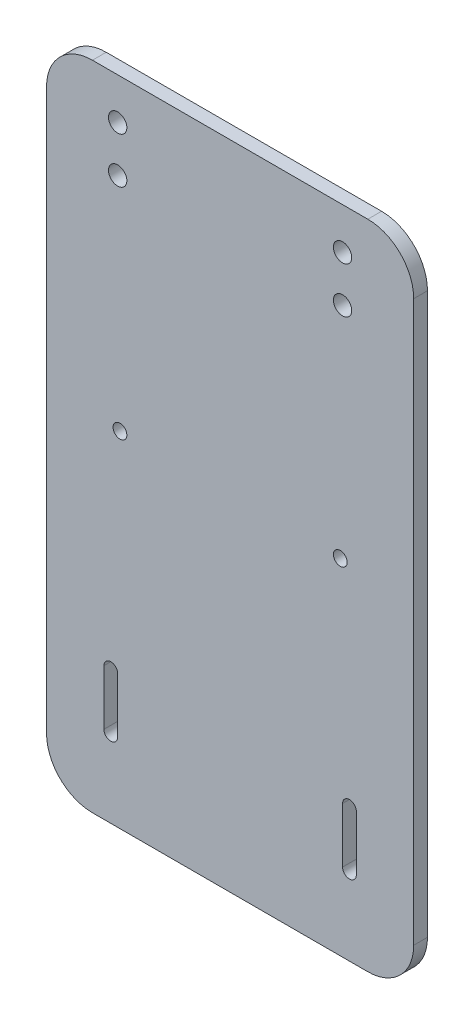
ISO-10303-21;
HEADER;
FILE_DESCRIPTION(('STEP AP214'),'2;1');
FILE_NAME('part.step','',(''),(''),'','','');
FILE_SCHEMA(('AUTOMOTIVE_DESIGN { 1 0 10303 214 1 1 1 1 }'));
ENDSEC;
DATA;
#1=APPLICATION_CONTEXT('core data for automotive mechanical design processes');
#2=APPLICATION_PROTOCOL_DEFINITION('international standard','automotive_design',2000,#1);
#3=PRODUCT_CONTEXT('',#1,'mechanical');
#4=PRODUCT('Part','Part','',(#3));
#5=PRODUCT_RELATED_PRODUCT_CATEGORY('part','',(#4));
#6=PRODUCT_DEFINITION_FORMATION('','',#4);
#7=PRODUCT_DEFINITION_CONTEXT('part definition',#1,'design');
#8=PRODUCT_DEFINITION('design','',#6,#7);
#9=PRODUCT_DEFINITION_SHAPE('','',#8);
#10=(LENGTH_UNIT() NAMED_UNIT(*) SI_UNIT(.MILLI.,.METRE.));
#11=(NAMED_UNIT(*) PLANE_ANGLE_UNIT() SI_UNIT($,.RADIAN.));
#12=(NAMED_UNIT(*) SI_UNIT($,.STERADIAN.) SOLID_ANGLE_UNIT());
#13=UNCERTAINTY_MEASURE_WITH_UNIT(LENGTH_MEASURE(1.E-05),#10,'distance_accuracy_value','');
#14=(GEOMETRIC_REPRESENTATION_CONTEXT(3) GLOBAL_UNCERTAINTY_ASSIGNED_CONTEXT((#13)) GLOBAL_UNIT_ASSIGNED_CONTEXT((#10,
#11,#12)) REPRESENTATION_CONTEXT('',''));
#15=CARTESIAN_POINT('',(0.,0.,0.));
#16=DIRECTION('',(0.,0.,1.));
#17=DIRECTION('',(1.,0.,0.));
#18=AXIS2_PLACEMENT_3D('',#15,#16,#17);
#19=CARTESIAN_POINT('',(0.,0.,3.));
#20=DIRECTION('',(0.,0.,1.));
#21=DIRECTION('',(1.,0.,0.));
#22=AXIS2_PLACEMENT_3D('',#19,#20,#21);
#23=PLANE('',#22);
#24=DIRECTION('',(1.,0.,0.));
#25=VECTOR('',#24,1.);
#26=CARTESIAN_POINT('',(-40.,67.,3.));
#27=LINE('',#26,#25);
#28=CARTESIAN_POINT('',(-30.,67.,3.));
#29=VERTEX_POINT('',#28);
#30=CARTESIAN_POINT('',(30.,67.,3.));
#31=VERTEX_POINT('',#30);
#32=EDGE_CURVE('E286',#29,#31,#27,.T.);
#33=ORIENTED_EDGE('',*,*,#32,.F.);
#34=CARTESIAN_POINT('',(-30.,57.,3.));
#35=DIRECTION('',(0.,0.,1.));
#36=DIRECTION('',(1.,0.,0.));
#37=AXIS2_PLACEMENT_3D('',#34,#35,#36);
#38=CIRCLE('',#37,10.);
#39=CARTESIAN_POINT('',(-40.,57.,3.));
#40=VERTEX_POINT('',#39);
#41=EDGE_CURVE('E258',#29,#40,#38,.T.);
#42=ORIENTED_EDGE('',*,*,#41,.T.);
#43=DIRECTION('',(0.,-1.,0.));
#44=VECTOR('',#43,1.);
#45=CARTESIAN_POINT('',(-40.,75.,3.));
#46=LINE('',#45,#44);
#47=CARTESIAN_POINT('',(-40.,-65.,3.));
#48=VERTEX_POINT('',#47);
#49=EDGE_CURVE('E199',#40,#48,#46,.T.);
#50=ORIENTED_EDGE('',*,*,#49,.T.);
#51=CARTESIAN_POINT('',(-30.,-65.,3.));
#52=DIRECTION('',(0.,0.,1.));
#53=DIRECTION('',(1.,0.,0.));
#54=AXIS2_PLACEMENT_3D('',#51,#52,#53);
#55=CIRCLE('',#54,10.);
#56=CARTESIAN_POINT('',(-30.,-75.,3.));
#57=VERTEX_POINT('',#56);
#58=EDGE_CURVE('E254',#48,#57,#55,.T.);
#59=ORIENTED_EDGE('',*,*,#58,.T.);
#60=DIRECTION('',(1.,0.,0.));
#61=VECTOR('',#60,1.);
#62=CARTESIAN_POINT('',(-40.,-75.,3.));
#63=LINE('',#62,#61);
#64=CARTESIAN_POINT('',(30.,-75.,3.));
#65=VERTEX_POINT('',#64);
#66=EDGE_CURVE('E203',#57,#65,#63,.T.);
#67=ORIENTED_EDGE('',*,*,#66,.T.);
#68=CARTESIAN_POINT('',(30.,-65.,3.));
#69=DIRECTION('',(0.,0.,1.));
#70=DIRECTION('',(1.,0.,0.));
#71=AXIS2_PLACEMENT_3D('',#68,#69,#70);
#72=CIRCLE('',#71,10.);
#73=CARTESIAN_POINT('',(40.,-65.,3.));
#74=VERTEX_POINT('',#73);
#75=EDGE_CURVE('E58',#65,#74,#72,.T.);
#76=ORIENTED_EDGE('',*,*,#75,.T.);
#77=DIRECTION('',(0.,1.,0.));
#78=VECTOR('',#77,1.);
#79=CARTESIAN_POINT('',(40.,75.,3.));
#80=LINE('',#79,#78);
#81=CARTESIAN_POINT('',(40.,57.,3.));
#82=VERTEX_POINT('',#81);
#83=EDGE_CURVE('E197',#74,#82,#80,.T.);
#84=ORIENTED_EDGE('',*,*,#83,.T.);
#85=CARTESIAN_POINT('',(30.,57.,3.));
#86=DIRECTION('',(0.,0.,1.));
#87=DIRECTION('',(1.,0.,0.));
#88=AXIS2_PLACEMENT_3D('',#85,#86,#87);
#89=CIRCLE('',#88,10.);
#90=EDGE_CURVE('E50',#82,#31,#89,.T.);
#91=ORIENTED_EDGE('',*,*,#90,.T.);
#92=EDGE_LOOP('',(#33,#42,#50,#59,#67,#76,#84,#91));
#93=FACE_BOUND('',#92,.T.);
#94=CARTESIAN_POINT('',(-24.5,58.,3.));
#95=DIRECTION('',(0.,0.,1.));
#96=DIRECTION('',(-1.,0.,0.));
#97=AXIS2_PLACEMENT_3D('',#94,#95,#96);
#98=CIRCLE('',#97,2.);
#99=CARTESIAN_POINT('',(-26.5,58.,3.));
#100=VERTEX_POINT('',#99);
#101=EDGE_CURVE('E297',#100,#100,#98,.T.);
#102=ORIENTED_EDGE('',*,*,#101,.F.);
#103=EDGE_LOOP('',(#102));
#104=FACE_BOUND('',#103,.T.);
#105=CARTESIAN_POINT('',(-24.5,48.,3.));
#106=DIRECTION('',(0.,0.,1.));
#107=DIRECTION('',(-1.,0.,0.));
#108=AXIS2_PLACEMENT_3D('',#105,#106,#107);
#109=CIRCLE('',#108,2.);
#110=CARTESIAN_POINT('',(-26.5,48.,3.));
#111=VERTEX_POINT('',#110);
#112=EDGE_CURVE('E300',#111,#111,#109,.T.);
#113=ORIENTED_EDGE('',*,*,#112,.F.);
#114=EDGE_LOOP('',(#113));
#115=FACE_BOUND('',#114,.T.);
#116=CARTESIAN_POINT('',(24.5,48.,3.));
#117=DIRECTION('',(0.,0.,1.));
#118=DIRECTION('',(1.,0.,0.));
#119=AXIS2_PLACEMENT_3D('',#116,#117,#118);
#120=CIRCLE('',#119,2.);
#121=CARTESIAN_POINT('',(26.5,48.,3.));
#122=VERTEX_POINT('',#121);
#123=EDGE_CURVE('E303',#122,#122,#120,.T.);
#124=ORIENTED_EDGE('',*,*,#123,.F.);
#125=EDGE_LOOP('',(#124));
#126=FACE_BOUND('',#125,.T.);
#127=CARTESIAN_POINT('',(24.5,58.,3.));
#128=DIRECTION('',(0.,0.,1.));
#129=DIRECTION('',(1.,0.,0.));
#130=AXIS2_PLACEMENT_3D('',#127,#128,#129);
#131=CIRCLE('',#130,2.);
#132=CARTESIAN_POINT('',(26.5,58.,3.));
#133=VERTEX_POINT('',#132);
#134=EDGE_CURVE('E228',#133,#133,#131,.T.);
#135=ORIENTED_EDGE('',*,*,#134,.F.);
#136=EDGE_LOOP('',(#135));
#137=FACE_BOUND('',#136,.T.);
#138=DIRECTION('',(0.,-1.,0.));
#139=VECTOR('',#138,1.);
#140=CARTESIAN_POINT('',(-27.5,-58.,3.));
#141=LINE('',#140,#139);
#142=CARTESIAN_POINT('',(-27.5,-46.,3.));
#143=VERTEX_POINT('',#142);
#144=CARTESIAN_POINT('',(-27.5,-58.,3.));
#145=VERTEX_POINT('',#144);
#146=EDGE_CURVE('E311',#143,#145,#141,.T.);
#147=ORIENTED_EDGE('',*,*,#146,.F.);
#148=CARTESIAN_POINT('',(-26.,-46.,3.));
#149=DIRECTION('',(0.,0.,1.));
#150=DIRECTION('',(1.,0.,0.));
#151=AXIS2_PLACEMENT_3D('',#148,#149,#150);
#152=CIRCLE('',#151,1.5);
#153=CARTESIAN_POINT('',(-24.5,-46.,3.));
#154=VERTEX_POINT('',#153);
#155=EDGE_CURVE('E171',#154,#143,#152,.T.);
#156=ORIENTED_EDGE('',*,*,#155,.F.);
#157=DIRECTION('',(0.,1.,0.));
#158=VECTOR('',#157,1.);
#159=CARTESIAN_POINT('',(-24.5,-58.,3.));
#160=LINE('',#159,#158);
#161=CARTESIAN_POINT('',(-24.5,-58.,3.));
#162=VERTEX_POINT('',#161);
#163=EDGE_CURVE('E154',#162,#154,#160,.T.);
#164=ORIENTED_EDGE('',*,*,#163,.F.);
#165=CARTESIAN_POINT('',(-26.,-58.,3.));
#166=DIRECTION('',(0.,0.,1.));
#167=DIRECTION('',(1.,0.,0.));
#168=AXIS2_PLACEMENT_3D('',#165,#166,#167);
#169=CIRCLE('',#168,1.5);
#170=EDGE_CURVE('E169',#145,#162,#169,.T.);
#171=ORIENTED_EDGE('',*,*,#170,.F.);
#172=EDGE_LOOP('',(#147,#156,#164,#171));
#173=FACE_BOUND('',#172,.T.);
#174=DIRECTION('',(0.,-1.,0.));
#175=VECTOR('',#174,1.);
#176=CARTESIAN_POINT('',(24.5,-58.,3.));
#177=LINE('',#176,#175);
#178=CARTESIAN_POINT('',(24.5,-46.,3.));
#179=VERTEX_POINT('',#178);
#180=CARTESIAN_POINT('',(24.5,-58.,3.));
#181=VERTEX_POINT('',#180);
#182=EDGE_CURVE('E323',#179,#181,#177,.T.);
#183=ORIENTED_EDGE('',*,*,#182,.F.);
#184=CARTESIAN_POINT('',(26.,-46.,3.));
#185=DIRECTION('',(0.,0.,1.));
#186=DIRECTION('',(-1.,0.,0.));
#187=AXIS2_PLACEMENT_3D('',#184,#185,#186);
#188=CIRCLE('',#187,1.5);
#189=CARTESIAN_POINT('',(27.5,-46.,3.));
#190=VERTEX_POINT('',#189);
#191=EDGE_CURVE('E320',#190,#179,#188,.T.);
#192=ORIENTED_EDGE('',*,*,#191,.F.);
#193=DIRECTION('',(0.,1.,0.));
#194=VECTOR('',#193,1.);
#195=CARTESIAN_POINT('',(27.5,-58.,3.));
#196=LINE('',#195,#194);
#197=CARTESIAN_POINT('',(27.5,-58.,3.));
#198=VERTEX_POINT('',#197);
#199=EDGE_CURVE('E237',#198,#190,#196,.T.);
#200=ORIENTED_EDGE('',*,*,#199,.F.);
#201=CARTESIAN_POINT('',(26.,-58.,3.));
#202=DIRECTION('',(0.,0.,1.));
#203=DIRECTION('',(1.,0.,0.));
#204=AXIS2_PLACEMENT_3D('',#201,#202,#203);
#205=CIRCLE('',#204,1.5);
#206=EDGE_CURVE('E182',#181,#198,#205,.T.);
#207=ORIENTED_EDGE('',*,*,#206,.F.);
#208=EDGE_LOOP('',(#183,#192,#200,#207));
#209=FACE_BOUND('',#208,.T.);
#210=CARTESIAN_POINT('',(24.,0.,3.));
#211=DIRECTION('',(0.,0.,1.));
#212=DIRECTION('',(1.,0.,0.));
#213=AXIS2_PLACEMENT_3D('',#210,#211,#212);
#214=CIRCLE('',#213,1.5);
#215=CARTESIAN_POINT('',(25.5,0.,3.));
#216=VERTEX_POINT('',#215);
#217=EDGE_CURVE('E191',#216,#216,#214,.T.);
#218=ORIENTED_EDGE('',*,*,#217,.F.);
#219=EDGE_LOOP('',(#218));
#220=FACE_BOUND('',#219,.T.);
#221=CARTESIAN_POINT('',(-24.,0.,3.));
#222=DIRECTION('',(0.,0.,1.));
#223=DIRECTION('',(-1.,0.,0.));
#224=AXIS2_PLACEMENT_3D('',#221,#222,#223);
#225=CIRCLE('',#224,1.5);
#226=CARTESIAN_POINT('',(-25.5,0.,3.));
#227=VERTEX_POINT('',#226);
#228=EDGE_CURVE('E180',#227,#227,#225,.T.);
#229=ORIENTED_EDGE('',*,*,#228,.F.);
#230=EDGE_LOOP('',(#229));
#231=FACE_BOUND('',#230,.T.);
#232=ADVANCED_FACE('F35',(#93,#104,#115,#126,#137,#173,#209,#220,#231),#23,.T.);
#233=CARTESIAN_POINT('',(0.,0.,0.));
#234=DIRECTION('',(0.,0.,1.));
#235=DIRECTION('',(1.,0.,0.));
#236=AXIS2_PLACEMENT_3D('',#233,#234,#235);
#237=PLANE('',#236);
#238=CARTESIAN_POINT('',(-24.5,58.,0.));
#239=DIRECTION('',(0.,0.,1.));
#240=DIRECTION('',(1.,0.,0.));
#241=AXIS2_PLACEMENT_3D('',#238,#239,#240);
#242=CIRCLE('',#241,2.);
#243=CARTESIAN_POINT('',(-22.5,58.,0.));
#244=VERTEX_POINT('',#243);
#245=EDGE_CURVE('E234',#244,#244,#242,.T.);
#246=ORIENTED_EDGE('',*,*,#245,.T.);
#247=EDGE_LOOP('',(#246));
#248=FACE_BOUND('',#247,.T.);
#249=CARTESIAN_POINT('',(-24.5,48.,0.));
#250=DIRECTION('',(0.,0.,1.));
#251=DIRECTION('',(1.,0.,0.));
#252=AXIS2_PLACEMENT_3D('',#249,#250,#251);
#253=CIRCLE('',#252,2.);
#254=CARTESIAN_POINT('',(-22.5,48.,0.));
#255=VERTEX_POINT('',#254);
#256=EDGE_CURVE('E231',#255,#255,#253,.T.);
#257=ORIENTED_EDGE('',*,*,#256,.T.);
#258=EDGE_LOOP('',(#257));
#259=FACE_BOUND('',#258,.T.);
#260=CARTESIAN_POINT('',(24.5,48.,0.));
#261=DIRECTION('',(0.,0.,1.));
#262=DIRECTION('',(1.,0.,0.));
#263=AXIS2_PLACEMENT_3D('',#260,#261,#262);
#264=CIRCLE('',#263,2.);
#265=CARTESIAN_POINT('',(26.5,48.,0.));
#266=VERTEX_POINT('',#265);
#267=EDGE_CURVE('E227',#266,#266,#264,.T.);
#268=ORIENTED_EDGE('',*,*,#267,.T.);
#269=EDGE_LOOP('',(#268));
#270=FACE_BOUND('',#269,.T.);
#271=CARTESIAN_POINT('',(24.5,58.,0.));
#272=DIRECTION('',(0.,0.,1.));
#273=DIRECTION('',(1.,0.,0.));
#274=AXIS2_PLACEMENT_3D('',#271,#272,#273);
#275=CIRCLE('',#274,2.);
#276=CARTESIAN_POINT('',(26.5,58.,0.));
#277=VERTEX_POINT('',#276);
#278=EDGE_CURVE('E224',#277,#277,#275,.T.);
#279=ORIENTED_EDGE('',*,*,#278,.T.);
#280=EDGE_LOOP('',(#279));
#281=FACE_BOUND('',#280,.T.);
#282=DIRECTION('',(0.,-1.,0.));
#283=VECTOR('',#282,1.);
#284=CARTESIAN_POINT('',(-40.,75.,0.));
#285=LINE('',#284,#283);
#286=CARTESIAN_POINT('',(-40.,57.,0.));
#287=VERTEX_POINT('',#286);
#288=CARTESIAN_POINT('',(-40.,-65.,0.));
#289=VERTEX_POINT('',#288);
#290=EDGE_CURVE('E208',#287,#289,#285,.T.);
#291=ORIENTED_EDGE('',*,*,#290,.F.);
#292=CARTESIAN_POINT('',(-30.,57.,0.));
#293=DIRECTION('',(0.,0.,1.));
#294=DIRECTION('',(1.,0.,0.));
#295=AXIS2_PLACEMENT_3D('',#292,#293,#294);
#296=CIRCLE('',#295,10.);
#297=CARTESIAN_POINT('',(-30.,67.,0.));
#298=VERTEX_POINT('',#297);
#299=EDGE_CURVE('E248',#287,#298,#296,.F.);
#300=ORIENTED_EDGE('',*,*,#299,.T.);
#301=DIRECTION('',(1.,0.,0.));
#302=VECTOR('',#301,1.);
#303=CARTESIAN_POINT('',(0.,67.,0.));
#304=LINE('',#303,#302);
#305=CARTESIAN_POINT('',(30.,67.,0.));
#306=VERTEX_POINT('',#305);
#307=EDGE_CURVE('E293',#298,#306,#304,.T.);
#308=ORIENTED_EDGE('',*,*,#307,.T.);
#309=CARTESIAN_POINT('',(30.,57.,0.));
#310=DIRECTION('',(0.,0.,1.));
#311=DIRECTION('',(1.,0.,0.));
#312=AXIS2_PLACEMENT_3D('',#309,#310,#311);
#313=CIRCLE('',#312,10.);
#314=CARTESIAN_POINT('',(40.,57.,0.));
#315=VERTEX_POINT('',#314);
#316=EDGE_CURVE('E246',#306,#315,#313,.F.);
#317=ORIENTED_EDGE('',*,*,#316,.T.);
#318=DIRECTION('',(0.,1.,0.));
#319=VECTOR('',#318,1.);
#320=CARTESIAN_POINT('',(40.,75.,0.));
#321=LINE('',#320,#319);
#322=CARTESIAN_POINT('',(40.,-65.,0.));
#323=VERTEX_POINT('',#322);
#324=EDGE_CURVE('E194',#323,#315,#321,.T.);
#325=ORIENTED_EDGE('',*,*,#324,.F.);
#326=CARTESIAN_POINT('',(30.,-65.,0.));
#327=DIRECTION('',(0.,0.,1.));
#328=DIRECTION('',(1.,0.,0.));
#329=AXIS2_PLACEMENT_3D('',#326,#327,#328);
#330=CIRCLE('',#329,10.);
#331=CARTESIAN_POINT('',(30.,-75.,0.));
#332=VERTEX_POINT('',#331);
#333=EDGE_CURVE('E244',#323,#332,#330,.F.);
#334=ORIENTED_EDGE('',*,*,#333,.T.);
#335=DIRECTION('',(1.,0.,0.));
#336=VECTOR('',#335,1.);
#337=CARTESIAN_POINT('',(-40.,-75.,0.));
#338=LINE('',#337,#336);
#339=CARTESIAN_POINT('',(-30.,-75.,0.));
#340=VERTEX_POINT('',#339);
#341=EDGE_CURVE('E200',#340,#332,#338,.T.);
#342=ORIENTED_EDGE('',*,*,#341,.F.);
#343=CARTESIAN_POINT('',(-30.,-65.,0.));
#344=DIRECTION('',(0.,0.,1.));
#345=DIRECTION('',(1.,0.,0.));
#346=AXIS2_PLACEMENT_3D('',#343,#344,#345);
#347=CIRCLE('',#346,10.);
#348=EDGE_CURVE('E242',#340,#289,#347,.F.);
#349=ORIENTED_EDGE('',*,*,#348,.T.);
#350=EDGE_LOOP('',(#291,#300,#308,#317,#325,#334,#342,#349));
#351=FACE_BOUND('',#350,.T.);
#352=CARTESIAN_POINT('',(24.,0.,0.));
#353=DIRECTION('',(0.,0.,1.));
#354=DIRECTION('',(1.,0.,0.));
#355=AXIS2_PLACEMENT_3D('',#352,#353,#354);
#356=CIRCLE('',#355,1.5);
#357=CARTESIAN_POINT('',(25.5,0.,0.));
#358=VERTEX_POINT('',#357);
#359=EDGE_CURVE('E189',#358,#358,#356,.T.);
#360=ORIENTED_EDGE('',*,*,#359,.T.);
#361=EDGE_LOOP('',(#360));
#362=FACE_BOUND('',#361,.T.);
#363=CARTESIAN_POINT('',(-24.,0.,0.));
#364=DIRECTION('',(0.,0.,1.));
#365=DIRECTION('',(-1.,0.,0.));
#366=AXIS2_PLACEMENT_3D('',#363,#364,#365);
#367=CIRCLE('',#366,1.5);
#368=CARTESIAN_POINT('',(-25.5,0.,0.));
#369=VERTEX_POINT('',#368);
#370=EDGE_CURVE('E176',#369,#369,#367,.T.);
#371=ORIENTED_EDGE('',*,*,#370,.T.);
#372=EDGE_LOOP('',(#371));
#373=FACE_BOUND('',#372,.T.);
#374=CARTESIAN_POINT('',(-26.,-46.,0.));
#375=DIRECTION('',(0.,0.,1.));
#376=DIRECTION('',(1.,0.,0.));
#377=AXIS2_PLACEMENT_3D('',#374,#375,#376);
#378=CIRCLE('',#377,1.5);
#379=CARTESIAN_POINT('',(-24.5,-46.,0.));
#380=VERTEX_POINT('',#379);
#381=CARTESIAN_POINT('',(-27.5,-46.,0.));
#382=VERTEX_POINT('',#381);
#383=EDGE_CURVE('E220',#380,#382,#378,.T.);
#384=ORIENTED_EDGE('',*,*,#383,.T.);
#385=DIRECTION('',(0.,-1.,0.));
#386=VECTOR('',#385,1.);
#387=CARTESIAN_POINT('',(-27.5,0.,0.));
#388=LINE('',#387,#386);
#389=CARTESIAN_POINT('',(-27.5,-58.,0.));
#390=VERTEX_POINT('',#389);
#391=EDGE_CURVE('E334',#382,#390,#388,.T.);
#392=ORIENTED_EDGE('',*,*,#391,.T.);
#393=CARTESIAN_POINT('',(-26.,-58.,0.));
#394=DIRECTION('',(0.,0.,1.));
#395=DIRECTION('',(1.,0.,0.));
#396=AXIS2_PLACEMENT_3D('',#393,#394,#395);
#397=CIRCLE('',#396,1.5);
#398=CARTESIAN_POINT('',(-24.5,-58.,0.));
#399=VERTEX_POINT('',#398);
#400=EDGE_CURVE('E177',#390,#399,#397,.T.);
#401=ORIENTED_EDGE('',*,*,#400,.T.);
#402=DIRECTION('',(0.,1.,0.));
#403=VECTOR('',#402,1.);
#404=CARTESIAN_POINT('',(-24.5,0.,0.));
#405=LINE('',#404,#403);
#406=EDGE_CURVE('E157',#399,#380,#405,.T.);
#407=ORIENTED_EDGE('',*,*,#406,.T.);
#408=EDGE_LOOP('',(#384,#392,#401,#407));
#409=FACE_BOUND('',#408,.T.);
#410=CARTESIAN_POINT('',(26.,-46.,0.));
#411=DIRECTION('',(0.,0.,1.));
#412=DIRECTION('',(1.,0.,0.));
#413=AXIS2_PLACEMENT_3D('',#410,#411,#412);
#414=CIRCLE('',#413,1.5);
#415=CARTESIAN_POINT('',(27.5,-46.,0.));
#416=VERTEX_POINT('',#415);
#417=CARTESIAN_POINT('',(24.5,-46.,0.));
#418=VERTEX_POINT('',#417);
#419=EDGE_CURVE('E217',#416,#418,#414,.T.);
#420=ORIENTED_EDGE('',*,*,#419,.T.);
#421=DIRECTION('',(0.,-1.,0.));
#422=VECTOR('',#421,1.);
#423=CARTESIAN_POINT('',(24.5000000000001,0.,0.));
#424=LINE('',#423,#422);
#425=CARTESIAN_POINT('',(24.5,-58.,0.));
#426=VERTEX_POINT('',#425);
#427=EDGE_CURVE('E330',#418,#426,#424,.T.);
#428=ORIENTED_EDGE('',*,*,#427,.T.);
#429=CARTESIAN_POINT('',(26.,-58.,0.));
#430=DIRECTION('',(0.,0.,1.));
#431=DIRECTION('',(1.,0.,0.));
#432=AXIS2_PLACEMENT_3D('',#429,#430,#431);
#433=CIRCLE('',#432,1.5);
#434=CARTESIAN_POINT('',(27.5,-58.,0.));
#435=VERTEX_POINT('',#434);
#436=EDGE_CURVE('E185',#426,#435,#433,.T.);
#437=ORIENTED_EDGE('',*,*,#436,.T.);
#438=DIRECTION('',(0.,1.,0.));
#439=VECTOR('',#438,1.);
#440=CARTESIAN_POINT('',(27.5,0.,0.));
#441=LINE('',#440,#439);
#442=EDGE_CURVE('E316',#435,#416,#441,.T.);
#443=ORIENTED_EDGE('',*,*,#442,.T.);
#444=EDGE_LOOP('',(#420,#428,#437,#443));
#445=FACE_BOUND('',#444,.T.);
#446=ADVANCED_FACE('F275',(#248,#259,#270,#281,#351,#362,#373,#409,#445),#237,.F.);
#447=CARTESIAN_POINT('',(40.,75.,3.));
#448=DIRECTION('',(-1.,0.,0.));
#449=DIRECTION('',(0.,-1.,0.));
#450=AXIS2_PLACEMENT_3D('',#447,#448,#449);
#451=PLANE('',#450);
#452=ORIENTED_EDGE('',*,*,#324,.T.);
#453=DIRECTION('',(0.,0.,1.));
#454=VECTOR('',#453,1.);
#455=CARTESIAN_POINT('',(40.,57.,3.));
#456=LINE('',#455,#454);
#457=EDGE_CURVE('E263',#315,#82,#456,.T.);
#458=ORIENTED_EDGE('',*,*,#457,.T.);
#459=ORIENTED_EDGE('',*,*,#83,.F.);
#460=DIRECTION('',(0.,0.,-1.));
#461=VECTOR('',#460,1.);
#462=CARTESIAN_POINT('',(40.,-65.,3.));
#463=LINE('',#462,#461);
#464=EDGE_CURVE('E260',#74,#323,#463,.T.);
#465=ORIENTED_EDGE('',*,*,#464,.T.);
#466=EDGE_LOOP('',(#452,#458,#459,#465));
#467=FACE_BOUND('',#466,.T.);
#468=ADVANCED_FACE('F282',(#467),#451,.F.);
#469=CARTESIAN_POINT('',(-40.,75.,3.));
#470=DIRECTION('',(1.,0.,0.));
#471=DIRECTION('',(0.,1.,0.));
#472=AXIS2_PLACEMENT_3D('',#469,#470,#471);
#473=PLANE('',#472);
#474=ORIENTED_EDGE('',*,*,#49,.F.);
#475=DIRECTION('',(0.,0.,-1.));
#476=VECTOR('',#475,1.);
#477=CARTESIAN_POINT('',(-40.,57.,3.));
#478=LINE('',#477,#476);
#479=EDGE_CURVE('E239',#40,#287,#478,.T.);
#480=ORIENTED_EDGE('',*,*,#479,.T.);
#481=ORIENTED_EDGE('',*,*,#290,.T.);
#482=DIRECTION('',(0.,0.,-1.));
#483=VECTOR('',#482,1.);
#484=CARTESIAN_POINT('',(-40.,-65.,3.));
#485=LINE('',#484,#483);
#486=EDGE_CURVE('E223',#289,#48,#485,.F.);
#487=ORIENTED_EDGE('',*,*,#486,.T.);
#488=EDGE_LOOP('',(#474,#480,#481,#487));
#489=FACE_BOUND('',#488,.T.);
#490=ADVANCED_FACE('F379',(#489),#473,.F.);
#491=CARTESIAN_POINT('',(-40.,-75.,3.));
#492=DIRECTION('',(0.,1.,0.));
#493=DIRECTION('',(-1.,0.,0.));
#494=AXIS2_PLACEMENT_3D('',#491,#492,#493);
#495=PLANE('',#494);
#496=ORIENTED_EDGE('',*,*,#341,.T.);
#497=DIRECTION('',(0.,0.,-1.));
#498=VECTOR('',#497,1.);
#499=CARTESIAN_POINT('',(30.,-75.,3.));
#500=LINE('',#499,#498);
#501=EDGE_CURVE('E11',#332,#65,#500,.F.);
#502=ORIENTED_EDGE('',*,*,#501,.T.);
#503=ORIENTED_EDGE('',*,*,#66,.F.);
#504=DIRECTION('',(0.,0.,-1.));
#505=VECTOR('',#504,1.);
#506=CARTESIAN_POINT('',(-30.,-75.,3.));
#507=LINE('',#506,#505);
#508=EDGE_CURVE('E43',#57,#340,#507,.T.);
#509=ORIENTED_EDGE('',*,*,#508,.T.);
#510=EDGE_LOOP('',(#496,#502,#503,#509));
#511=FACE_BOUND('',#510,.T.);
#512=ADVANCED_FACE('F269',(#511),#495,.F.);
#513=CARTESIAN_POINT('',(24.,0.,3.));
#514=DIRECTION('',(0.,0.,-1.));
#515=DIRECTION('',(-1.,0.,0.));
#516=AXIS2_PLACEMENT_3D('',#513,#514,#515);
#517=CYLINDRICAL_SURFACE('',#516,1.5);
#518=ORIENTED_EDGE('',*,*,#217,.T.);
#519=EDGE_LOOP('',(#518));
#520=FACE_BOUND('',#519,.T.);
#521=ORIENTED_EDGE('',*,*,#359,.F.);
#522=EDGE_LOOP('',(#521));
#523=FACE_BOUND('',#522,.T.);
#524=ADVANCED_FACE('F374',(#520,#523),#517,.F.);
#525=CARTESIAN_POINT('',(-24.,0.,3.));
#526=DIRECTION('',(0.,0.,-1.));
#527=DIRECTION('',(-1.,0.,0.));
#528=AXIS2_PLACEMENT_3D('',#525,#526,#527);
#529=CYLINDRICAL_SURFACE('',#528,1.5);
#530=ORIENTED_EDGE('',*,*,#228,.T.);
#531=EDGE_LOOP('',(#530));
#532=FACE_BOUND('',#531,.T.);
#533=ORIENTED_EDGE('',*,*,#370,.F.);
#534=EDGE_LOOP('',(#533));
#535=FACE_BOUND('',#534,.T.);
#536=ADVANCED_FACE('F552',(#532,#535),#529,.F.);
#537=CARTESIAN_POINT('',(-26.,-58.,3.));
#538=DIRECTION('',(0.,0.,-1.));
#539=DIRECTION('',(-1.,0.,0.));
#540=AXIS2_PLACEMENT_3D('',#537,#538,#539);
#541=CYLINDRICAL_SURFACE('',#540,1.5);
#542=DIRECTION('',(0.,0.,-1.));
#543=VECTOR('',#542,1.);
#544=CARTESIAN_POINT('',(-27.5,-58.,3.));
#545=LINE('',#544,#543);
#546=EDGE_CURVE('E162',#145,#390,#545,.T.);
#547=ORIENTED_EDGE('',*,*,#546,.F.);
#548=ORIENTED_EDGE('',*,*,#170,.T.);
#549=DIRECTION('',(0.,0.,-1.));
#550=VECTOR('',#549,1.);
#551=CARTESIAN_POINT('',(-24.5,-58.,3.));
#552=LINE('',#551,#550);
#553=EDGE_CURVE('E150',#162,#399,#552,.T.);
#554=ORIENTED_EDGE('',*,*,#553,.T.);
#555=ORIENTED_EDGE('',*,*,#400,.F.);
#556=EDGE_LOOP('',(#547,#548,#554,#555));
#557=FACE_BOUND('',#556,.T.);
#558=ADVANCED_FACE('F175',(#557),#541,.F.);
#559=CARTESIAN_POINT('',(26.,-58.,3.));
#560=DIRECTION('',(0.,0.,-1.));
#561=DIRECTION('',(-1.,0.,0.));
#562=AXIS2_PLACEMENT_3D('',#559,#560,#561);
#563=CYLINDRICAL_SURFACE('',#562,1.5);
#564=DIRECTION('',(0.,0.,-1.));
#565=VECTOR('',#564,1.);
#566=CARTESIAN_POINT('',(24.5,-58.,3.));
#567=LINE('',#566,#565);
#568=EDGE_CURVE('E163',#181,#426,#567,.T.);
#569=ORIENTED_EDGE('',*,*,#568,.F.);
#570=ORIENTED_EDGE('',*,*,#206,.T.);
#571=DIRECTION('',(0.,0.,-1.));
#572=VECTOR('',#571,1.);
#573=CARTESIAN_POINT('',(27.5,-58.,3.));
#574=LINE('',#573,#572);
#575=EDGE_CURVE('E205',#198,#435,#574,.T.);
#576=ORIENTED_EDGE('',*,*,#575,.T.);
#577=ORIENTED_EDGE('',*,*,#436,.F.);
#578=EDGE_LOOP('',(#569,#570,#576,#577));
#579=FACE_BOUND('',#578,.T.);
#580=ADVANCED_FACE('F343',(#579),#563,.F.);
#581=CARTESIAN_POINT('',(26.,-46.,-7.));
#582=DIRECTION('',(0.,0.,1.));
#583=DIRECTION('',(1.,0.,0.));
#584=AXIS2_PLACEMENT_3D('',#581,#582,#583);
#585=CYLINDRICAL_SURFACE('',#584,1.5);
#586=DIRECTION('',(0.,0.,1.));
#587=VECTOR('',#586,1.);
#588=CARTESIAN_POINT('',(27.5,-46.,-7.));
#589=LINE('',#588,#587);
#590=EDGE_CURVE('E325',#416,#190,#589,.T.);
#591=ORIENTED_EDGE('',*,*,#590,.T.);
#592=ORIENTED_EDGE('',*,*,#191,.T.);
#593=DIRECTION('',(0.,0.,1.));
#594=VECTOR('',#593,1.);
#595=CARTESIAN_POINT('',(24.5,-46.,-7.));
#596=LINE('',#595,#594);
#597=EDGE_CURVE('E172',#418,#179,#596,.T.);
#598=ORIENTED_EDGE('',*,*,#597,.F.);
#599=ORIENTED_EDGE('',*,*,#419,.F.);
#600=EDGE_LOOP('',(#591,#592,#598,#599));
#601=FACE_BOUND('',#600,.T.);
#602=ADVANCED_FACE('F353',(#601),#585,.F.);
#603=CARTESIAN_POINT('',(24.5,-58.,-7.));
#604=DIRECTION('',(-1.,0.,0.));
#605=DIRECTION('',(0.,-1.,0.));
#606=AXIS2_PLACEMENT_3D('',#603,#604,#605);
#607=PLANE('',#606);
#608=ORIENTED_EDGE('',*,*,#597,.T.);
#609=ORIENTED_EDGE('',*,*,#182,.T.);
#610=ORIENTED_EDGE('',*,*,#568,.T.);
#611=ORIENTED_EDGE('',*,*,#427,.F.);
#612=EDGE_LOOP('',(#608,#609,#610,#611));
#613=FACE_BOUND('',#612,.T.);
#614=ADVANCED_FACE('F355',(#613),#607,.F.);
#615=CARTESIAN_POINT('',(27.5,-58.,-7.));
#616=DIRECTION('',(1.,0.,0.));
#617=DIRECTION('',(0.,0.,-1.));
#618=AXIS2_PLACEMENT_3D('',#615,#616,#617);
#619=PLANE('',#618);
#620=ORIENTED_EDGE('',*,*,#575,.F.);
#621=ORIENTED_EDGE('',*,*,#199,.T.);
#622=ORIENTED_EDGE('',*,*,#590,.F.);
#623=ORIENTED_EDGE('',*,*,#442,.F.);
#624=EDGE_LOOP('',(#620,#621,#622,#623));
#625=FACE_BOUND('',#624,.T.);
#626=ADVANCED_FACE('F346',(#625),#619,.F.);
#627=CARTESIAN_POINT('',(-26.,-46.,-7.));
#628=DIRECTION('',(0.,0.,1.));
#629=DIRECTION('',(1.,0.,0.));
#630=AXIS2_PLACEMENT_3D('',#627,#628,#629);
#631=CYLINDRICAL_SURFACE('',#630,1.5);
#632=DIRECTION('',(0.,0.,1.));
#633=VECTOR('',#632,1.);
#634=CARTESIAN_POINT('',(-24.5,-46.,-7.));
#635=LINE('',#634,#633);
#636=EDGE_CURVE('E313',#380,#154,#635,.T.);
#637=ORIENTED_EDGE('',*,*,#636,.T.);
#638=ORIENTED_EDGE('',*,*,#155,.T.);
#639=DIRECTION('',(0.,0.,1.));
#640=VECTOR('',#639,1.);
#641=CARTESIAN_POINT('',(-27.5,-46.,-7.));
#642=LINE('',#641,#640);
#643=EDGE_CURVE('E314',#382,#143,#642,.T.);
#644=ORIENTED_EDGE('',*,*,#643,.F.);
#645=ORIENTED_EDGE('',*,*,#383,.F.);
#646=EDGE_LOOP('',(#637,#638,#644,#645));
#647=FACE_BOUND('',#646,.T.);
#648=ADVANCED_FACE('F362',(#647),#631,.F.);
#649=CARTESIAN_POINT('',(-27.5,-58.,-7.));
#650=DIRECTION('',(-1.,0.,0.));
#651=DIRECTION('',(0.,0.,1.));
#652=AXIS2_PLACEMENT_3D('',#649,#650,#651);
#653=PLANE('',#652);
#654=ORIENTED_EDGE('',*,*,#643,.T.);
#655=ORIENTED_EDGE('',*,*,#146,.T.);
#656=ORIENTED_EDGE('',*,*,#546,.T.);
#657=ORIENTED_EDGE('',*,*,#391,.F.);
#658=EDGE_LOOP('',(#654,#655,#656,#657));
#659=FACE_BOUND('',#658,.T.);
#660=ADVANCED_FACE('F502',(#659),#653,.F.);
#661=CARTESIAN_POINT('',(-24.5,-58.,-7.));
#662=DIRECTION('',(1.,0.,0.));
#663=DIRECTION('',(0.,1.,0.));
#664=AXIS2_PLACEMENT_3D('',#661,#662,#663);
#665=PLANE('',#664);
#666=ORIENTED_EDGE('',*,*,#553,.F.);
#667=ORIENTED_EDGE('',*,*,#163,.T.);
#668=ORIENTED_EDGE('',*,*,#636,.F.);
#669=ORIENTED_EDGE('',*,*,#406,.F.);
#670=EDGE_LOOP('',(#666,#667,#668,#669));
#671=FACE_BOUND('',#670,.T.);
#672=ADVANCED_FACE('F152',(#671),#665,.F.);
#673=CARTESIAN_POINT('',(24.5,58.,-7.));
#674=DIRECTION('',(0.,0.,1.));
#675=DIRECTION('',(1.,0.,0.));
#676=AXIS2_PLACEMENT_3D('',#673,#674,#675);
#677=CYLINDRICAL_SURFACE('',#676,2.);
#678=ORIENTED_EDGE('',*,*,#134,.T.);
#679=EDGE_LOOP('',(#678));
#680=FACE_BOUND('',#679,.T.);
#681=ORIENTED_EDGE('',*,*,#278,.F.);
#682=EDGE_LOOP('',(#681));
#683=FACE_BOUND('',#682,.T.);
#684=ADVANCED_FACE('F483',(#680,#683),#677,.F.);
#685=CARTESIAN_POINT('',(24.5,48.,-7.));
#686=DIRECTION('',(0.,0.,1.));
#687=DIRECTION('',(1.,0.,0.));
#688=AXIS2_PLACEMENT_3D('',#685,#686,#687);
#689=CYLINDRICAL_SURFACE('',#688,2.);
#690=ORIENTED_EDGE('',*,*,#123,.T.);
#691=EDGE_LOOP('',(#690));
#692=FACE_BOUND('',#691,.T.);
#693=ORIENTED_EDGE('',*,*,#267,.F.);
#694=EDGE_LOOP('',(#693));
#695=FACE_BOUND('',#694,.T.);
#696=ADVANCED_FACE('F473',(#692,#695),#689,.F.);
#697=CARTESIAN_POINT('',(-24.5,48.,-7.));
#698=DIRECTION('',(0.,0.,1.));
#699=DIRECTION('',(1.,0.,0.));
#700=AXIS2_PLACEMENT_3D('',#697,#698,#699);
#701=CYLINDRICAL_SURFACE('',#700,2.);
#702=ORIENTED_EDGE('',*,*,#112,.T.);
#703=EDGE_LOOP('',(#702));
#704=FACE_BOUND('',#703,.T.);
#705=ORIENTED_EDGE('',*,*,#256,.F.);
#706=EDGE_LOOP('',(#705));
#707=FACE_BOUND('',#706,.T.);
#708=ADVANCED_FACE('F463',(#704,#707),#701,.F.);
#709=CARTESIAN_POINT('',(-24.5,58.,-7.));
#710=DIRECTION('',(0.,0.,1.));
#711=DIRECTION('',(1.,0.,0.));
#712=AXIS2_PLACEMENT_3D('',#709,#710,#711);
#713=CYLINDRICAL_SURFACE('',#712,2.);
#714=ORIENTED_EDGE('',*,*,#101,.T.);
#715=EDGE_LOOP('',(#714));
#716=FACE_BOUND('',#715,.T.);
#717=ORIENTED_EDGE('',*,*,#245,.F.);
#718=EDGE_LOOP('',(#717));
#719=FACE_BOUND('',#718,.T.);
#720=ADVANCED_FACE('F424',(#716,#719),#713,.F.);
#721=CARTESIAN_POINT('',(-40.,67.,-7.));
#722=DIRECTION('',(0.,-1.,0.));
#723=DIRECTION('',(0.,0.,-1.));
#724=AXIS2_PLACEMENT_3D('',#721,#722,#723);
#725=PLANE('',#724);
#726=ORIENTED_EDGE('',*,*,#307,.F.);
#727=DIRECTION('',(0.,0.,-1.));
#728=VECTOR('',#727,1.);
#729=CARTESIAN_POINT('',(-30.,67.,-7.));
#730=LINE('',#729,#728);
#731=EDGE_CURVE('E252',#298,#29,#730,.F.);
#732=ORIENTED_EDGE('',*,*,#731,.T.);
#733=ORIENTED_EDGE('',*,*,#32,.T.);
#734=DIRECTION('',(0.,0.,1.));
#735=VECTOR('',#734,1.);
#736=CARTESIAN_POINT('',(30.,67.,-7.));
#737=LINE('',#736,#735);
#738=EDGE_CURVE('E250',#31,#306,#737,.F.);
#739=ORIENTED_EDGE('',*,*,#738,.T.);
#740=EDGE_LOOP('',(#726,#732,#733,#739));
#741=FACE_BOUND('',#740,.T.);
#742=ADVANCED_FACE('F290',(#741),#725,.F.);
#743=CARTESIAN_POINT('',(-30.,57.,3.));
#744=DIRECTION('',(0.,0.,-1.));
#745=DIRECTION('',(-1.,0.,0.));
#746=AXIS2_PLACEMENT_3D('',#743,#744,#745);
#747=CYLINDRICAL_SURFACE('',#746,10.);
#748=ORIENTED_EDGE('',*,*,#41,.F.);
#749=ORIENTED_EDGE('',*,*,#731,.F.);
#750=ORIENTED_EDGE('',*,*,#299,.F.);
#751=ORIENTED_EDGE('',*,*,#479,.F.);
#752=EDGE_LOOP('',(#748,#749,#750,#751));
#753=FACE_BOUND('',#752,.T.);
#754=ADVANCED_FACE('F385',(#753),#747,.T.);
#755=CARTESIAN_POINT('',(30.,57.,3.));
#756=DIRECTION('',(0.,0.,1.));
#757=DIRECTION('',(1.,0.,0.));
#758=AXIS2_PLACEMENT_3D('',#755,#756,#757);
#759=CYLINDRICAL_SURFACE('',#758,10.);
#760=ORIENTED_EDGE('',*,*,#316,.F.);
#761=ORIENTED_EDGE('',*,*,#738,.F.);
#762=ORIENTED_EDGE('',*,*,#90,.F.);
#763=ORIENTED_EDGE('',*,*,#457,.F.);
#764=EDGE_LOOP('',(#760,#761,#762,#763));
#765=FACE_BOUND('',#764,.T.);
#766=ADVANCED_FACE('F296',(#765),#759,.T.);
#767=CARTESIAN_POINT('',(30.,-65.,3.));
#768=DIRECTION('',(0.,0.,-1.));
#769=DIRECTION('',(-1.,0.,0.));
#770=AXIS2_PLACEMENT_3D('',#767,#768,#769);
#771=CYLINDRICAL_SURFACE('',#770,10.);
#772=ORIENTED_EDGE('',*,*,#75,.F.);
#773=ORIENTED_EDGE('',*,*,#501,.F.);
#774=ORIENTED_EDGE('',*,*,#333,.F.);
#775=ORIENTED_EDGE('',*,*,#464,.F.);
#776=EDGE_LOOP('',(#772,#773,#774,#775));
#777=FACE_BOUND('',#776,.T.);
#778=ADVANCED_FACE('F280',(#777),#771,.T.);
#779=CARTESIAN_POINT('',(-30.,-65.,3.));
#780=DIRECTION('',(0.,0.,-1.));
#781=DIRECTION('',(-1.,0.,0.));
#782=AXIS2_PLACEMENT_3D('',#779,#780,#781);
#783=CYLINDRICAL_SURFACE('',#782,10.);
#784=ORIENTED_EDGE('',*,*,#58,.F.);
#785=ORIENTED_EDGE('',*,*,#486,.F.);
#786=ORIENTED_EDGE('',*,*,#348,.F.);
#787=ORIENTED_EDGE('',*,*,#508,.F.);
#788=EDGE_LOOP('',(#784,#785,#786,#787));
#789=FACE_BOUND('',#788,.T.);
#790=ADVANCED_FACE('F37',(#789),#783,.T.);
#791=CLOSED_SHELL('',(#232,#446,#468,#490,#512,#524,#536,#558,#580,#602,#614,#626,#648,#660,
#672,#684,#696,#708,#720,#742,#754,#766,#778,#790));
#792=MANIFOLD_SOLID_BREP('B2',#791);
#793=ADVANCED_BREP_SHAPE_REPRESENTATION('',(#18,#792),#14);
#794=SHAPE_DEFINITION_REPRESENTATION(#9,#793);
ENDSEC;
END-ISO-10303-21;
